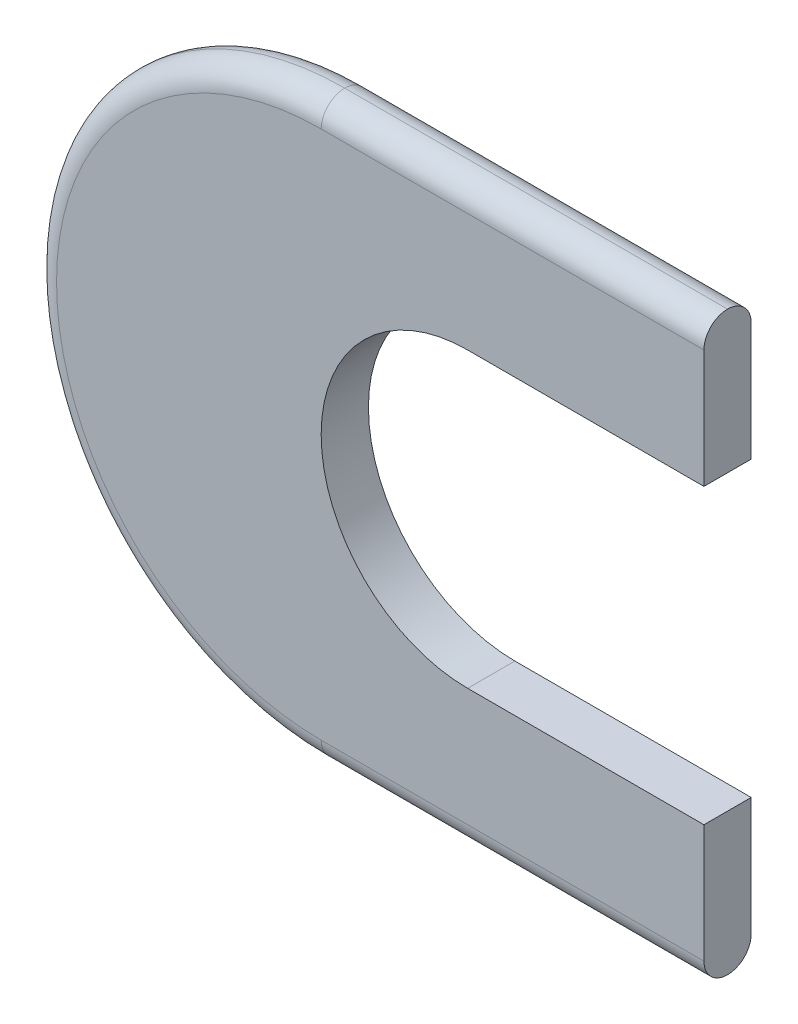
ISO-10303-21;
HEADER;
FILE_DESCRIPTION(('STEP AP214'),'2;1');
FILE_NAME('part.step','',(''),(''),'','','');
FILE_SCHEMA(('AUTOMOTIVE_DESIGN { 1 0 10303 214 1 1 1 1 }'));
ENDSEC;
DATA;
#1=APPLICATION_CONTEXT('core data for automotive mechanical design processes');
#2=APPLICATION_PROTOCOL_DEFINITION('international standard','automotive_design',2000,#1);
#3=PRODUCT_CONTEXT('',#1,'mechanical');
#4=PRODUCT('Part','Part','',(#3));
#5=PRODUCT_RELATED_PRODUCT_CATEGORY('part','',(#4));
#6=PRODUCT_DEFINITION_FORMATION('','',#4);
#7=PRODUCT_DEFINITION_CONTEXT('part definition',#1,'design');
#8=PRODUCT_DEFINITION('design','',#6,#7);
#9=PRODUCT_DEFINITION_SHAPE('','',#8);
#10=(LENGTH_UNIT() NAMED_UNIT(*) SI_UNIT(.MILLI.,.METRE.));
#11=(NAMED_UNIT(*) PLANE_ANGLE_UNIT() SI_UNIT($,.RADIAN.));
#12=(NAMED_UNIT(*) SI_UNIT($,.STERADIAN.) SOLID_ANGLE_UNIT());
#13=UNCERTAINTY_MEASURE_WITH_UNIT(LENGTH_MEASURE(1.E-05),#10,'distance_accuracy_value','');
#14=(GEOMETRIC_REPRESENTATION_CONTEXT(3) GLOBAL_UNCERTAINTY_ASSIGNED_CONTEXT((#13)) GLOBAL_UNIT_ASSIGNED_CONTEXT((#10,
#11,#12)) REPRESENTATION_CONTEXT('',''));
#15=CARTESIAN_POINT('',(0.,0.,0.));
#16=DIRECTION('',(0.,0.,1.));
#17=DIRECTION('',(1.,0.,0.));
#18=AXIS2_PLACEMENT_3D('',#15,#16,#17);
#19=CARTESIAN_POINT('',(0.,0.,1.));
#20=DIRECTION('',(0.,0.,-1.));
#21=DIRECTION('',(-1.,0.,0.));
#22=AXIS2_PLACEMENT_3D('',#19,#20,#21);
#23=CYLINDRICAL_SURFACE('',#22,3.1);
#24=CARTESIAN_POINT('',(0.,0.,0.));
#25=DIRECTION('',(0.,0.,-1.));
#26=DIRECTION('',(1.,0.,0.));
#27=AXIS2_PLACEMENT_3D('',#24,#25,#26);
#28=CIRCLE('',#27,3.1);
#29=CARTESIAN_POINT('',(0.,-3.1,0.));
#30=VERTEX_POINT('',#29);
#31=CARTESIAN_POINT('',(0.,3.1,0.));
#32=VERTEX_POINT('',#31);
#33=EDGE_CURVE('E180',#30,#32,#28,.T.);
#34=ORIENTED_EDGE('',*,*,#33,.T.);
#35=DIRECTION('',(0.,0.,-1.));
#36=VECTOR('',#35,1.);
#37=CARTESIAN_POINT('',(0.,3.1,1.));
#38=LINE('',#37,#36);
#39=CARTESIAN_POINT('',(0.,3.1,1.));
#40=VERTEX_POINT('',#39);
#41=EDGE_CURVE('E215',#40,#32,#38,.T.);
#42=ORIENTED_EDGE('',*,*,#41,.F.);
#43=CARTESIAN_POINT('',(0.,0.,1.));
#44=DIRECTION('',(0.,0.,-1.));
#45=DIRECTION('',(1.,0.,0.));
#46=AXIS2_PLACEMENT_3D('',#43,#44,#45);
#47=CIRCLE('',#46,3.1);
#48=CARTESIAN_POINT('',(0.,-3.1,1.));
#49=VERTEX_POINT('',#48);
#50=EDGE_CURVE('E203',#49,#40,#47,.T.);
#51=ORIENTED_EDGE('',*,*,#50,.F.);
#52=DIRECTION('',(0.,0.,-1.));
#53=VECTOR('',#52,1.);
#54=CARTESIAN_POINT('',(0.,-3.1,1.));
#55=LINE('',#54,#53);
#56=EDGE_CURVE('E204',#49,#30,#55,.T.);
#57=ORIENTED_EDGE('',*,*,#56,.T.);
#58=EDGE_LOOP('',(#34,#42,#51,#57));
#59=FACE_BOUND('',#58,.T.);
#60=ADVANCED_FACE('F39',(#59),#23,.F.);
#61=CARTESIAN_POINT('',(0.,3.1,1.));
#62=DIRECTION('',(0.,1.,0.));
#63=DIRECTION('',(0.,0.,1.));
#64=AXIS2_PLACEMENT_3D('',#61,#62,#63);
#65=PLANE('',#64);
#66=DIRECTION('',(1.,0.,0.));
#67=VECTOR('',#66,1.);
#68=CARTESIAN_POINT('',(0.,3.1,0.));
#69=LINE('',#68,#67);
#70=CARTESIAN_POINT('',(5.,3.1,0.));
#71=VERTEX_POINT('',#70);
#72=EDGE_CURVE('E83',#32,#71,#69,.T.);
#73=ORIENTED_EDGE('',*,*,#72,.T.);
#74=DIRECTION('',(0.,0.,-1.));
#75=VECTOR('',#74,1.);
#76=CARTESIAN_POINT('',(5.,3.1,1.));
#77=LINE('',#76,#75);
#78=CARTESIAN_POINT('',(5.,3.1,1.));
#79=VERTEX_POINT('',#78);
#80=EDGE_CURVE('E211',#79,#71,#77,.T.);
#81=ORIENTED_EDGE('',*,*,#80,.F.);
#82=DIRECTION('',(1.,0.,0.));
#83=VECTOR('',#82,1.);
#84=CARTESIAN_POINT('',(0.,3.1,1.));
#85=LINE('',#84,#83);
#86=EDGE_CURVE('E245',#40,#79,#85,.T.);
#87=ORIENTED_EDGE('',*,*,#86,.F.);
#88=ORIENTED_EDGE('',*,*,#41,.T.);
#89=EDGE_LOOP('',(#73,#81,#87,#88));
#90=FACE_BOUND('',#89,.T.);
#91=ADVANCED_FACE('F257',(#90),#65,.F.);
#92=CARTESIAN_POINT('',(5.,3.1,1.));
#93=DIRECTION('',(-1.,0.,0.));
#94=DIRECTION('',(0.,0.,1.));
#95=AXIS2_PLACEMENT_3D('',#92,#93,#94);
#96=PLANE('',#95);
#97=DIRECTION('',(0.,1.,0.));
#98=VECTOR('',#97,1.);
#99=CARTESIAN_POINT('',(5.,3.1,0.));
#100=LINE('',#99,#98);
#101=CARTESIAN_POINT('',(5.,5.6,0.));
#102=VERTEX_POINT('',#101);
#103=EDGE_CURVE('E188',#71,#102,#100,.T.);
#104=ORIENTED_EDGE('',*,*,#103,.T.);
#105=CARTESIAN_POINT('',(5.,5.6,0.5));
#106=DIRECTION('',(-1.,0.,0.));
#107=DIRECTION('',(0.,0.,1.));
#108=AXIS2_PLACEMENT_3D('',#105,#106,#107);
#109=CIRCLE('',#108,0.5);
#110=CARTESIAN_POINT('',(5.,6.1,0.5));
#111=VERTEX_POINT('',#110);
#112=EDGE_CURVE('E129',#102,#111,#109,.F.);
#113=ORIENTED_EDGE('',*,*,#112,.T.);
#114=CARTESIAN_POINT('',(5.,5.6,0.5));
#115=DIRECTION('',(-1.,0.,0.));
#116=DIRECTION('',(0.,0.,1.));
#117=AXIS2_PLACEMENT_3D('',#114,#115,#116);
#118=CIRCLE('',#117,0.5);
#119=CARTESIAN_POINT('',(5.,5.6,1.));
#120=VERTEX_POINT('',#119);
#121=EDGE_CURVE('E167',#111,#120,#118,.F.);
#122=ORIENTED_EDGE('',*,*,#121,.T.);
#123=DIRECTION('',(0.,1.,0.));
#124=VECTOR('',#123,1.);
#125=CARTESIAN_POINT('',(5.,3.1,1.));
#126=LINE('',#125,#124);
#127=EDGE_CURVE('E243',#79,#120,#126,.T.);
#128=ORIENTED_EDGE('',*,*,#127,.F.);
#129=ORIENTED_EDGE('',*,*,#80,.T.);
#130=EDGE_LOOP('',(#104,#113,#122,#128,#129));
#131=FACE_BOUND('',#130,.T.);
#132=ADVANCED_FACE('F227',(#131),#96,.F.);
#133=CARTESIAN_POINT('',(5.,-3.1,1.));
#134=DIRECTION('',(-1.,0.,0.));
#135=DIRECTION('',(0.,0.,1.));
#136=AXIS2_PLACEMENT_3D('',#133,#134,#135);
#137=PLANE('',#136);
#138=CARTESIAN_POINT('',(5.,-5.6,0.5));
#139=DIRECTION('',(-1.,0.,0.));
#140=DIRECTION('',(0.,0.,1.));
#141=AXIS2_PLACEMENT_3D('',#138,#139,#140);
#142=CIRCLE('',#141,0.5);
#143=CARTESIAN_POINT('',(5.,-5.6,1.));
#144=VERTEX_POINT('',#143);
#145=CARTESIAN_POINT('',(5.,-6.1,0.5));
#146=VERTEX_POINT('',#145);
#147=EDGE_CURVE('E120',#144,#146,#142,.F.);
#148=ORIENTED_EDGE('',*,*,#147,.T.);
#149=CARTESIAN_POINT('',(5.,-5.6,0.5));
#150=DIRECTION('',(-1.,0.,0.));
#151=DIRECTION('',(0.,0.,1.));
#152=AXIS2_PLACEMENT_3D('',#149,#150,#151);
#153=CIRCLE('',#152,0.5);
#154=CARTESIAN_POINT('',(5.,-5.6,0.));
#155=VERTEX_POINT('',#154);
#156=EDGE_CURVE('E123',#146,#155,#153,.F.);
#157=ORIENTED_EDGE('',*,*,#156,.T.);
#158=DIRECTION('',(0.,1.,0.));
#159=VECTOR('',#158,1.);
#160=CARTESIAN_POINT('',(5.,-3.1,0.));
#161=LINE('',#160,#159);
#162=CARTESIAN_POINT('',(5.,-3.1,0.));
#163=VERTEX_POINT('',#162);
#164=EDGE_CURVE('E197',#155,#163,#161,.T.);
#165=ORIENTED_EDGE('',*,*,#164,.T.);
#166=DIRECTION('',(0.,0.,-1.));
#167=VECTOR('',#166,1.);
#168=CARTESIAN_POINT('',(5.,-3.1,1.));
#169=LINE('',#168,#167);
#170=CARTESIAN_POINT('',(5.,-3.1,1.));
#171=VERTEX_POINT('',#170);
#172=EDGE_CURVE('E207',#171,#163,#169,.T.);
#173=ORIENTED_EDGE('',*,*,#172,.F.);
#174=DIRECTION('',(0.,1.,0.));
#175=VECTOR('',#174,1.);
#176=CARTESIAN_POINT('',(5.,-3.1,1.));
#177=LINE('',#176,#175);
#178=EDGE_CURVE('E127',#144,#171,#177,.T.);
#179=ORIENTED_EDGE('',*,*,#178,.F.);
#180=EDGE_LOOP('',(#148,#157,#165,#173,#179));
#181=FACE_BOUND('',#180,.T.);
#182=ADVANCED_FACE('F121',(#181),#137,.F.);
#183=CARTESIAN_POINT('',(0.,-3.1,1.));
#184=DIRECTION('',(0.,-1.,0.));
#185=DIRECTION('',(0.,0.,-1.));
#186=AXIS2_PLACEMENT_3D('',#183,#184,#185);
#187=PLANE('',#186);
#188=DIRECTION('',(-1.,0.,0.));
#189=VECTOR('',#188,1.);
#190=CARTESIAN_POINT('',(0.,-3.1,0.));
#191=LINE('',#190,#189);
#192=EDGE_CURVE('E200',#163,#30,#191,.T.);
#193=ORIENTED_EDGE('',*,*,#192,.T.);
#194=ORIENTED_EDGE('',*,*,#56,.F.);
#195=DIRECTION('',(-1.,0.,0.));
#196=VECTOR('',#195,1.);
#197=CARTESIAN_POINT('',(0.,-3.1,1.));
#198=LINE('',#197,#196);
#199=EDGE_CURVE('E191',#171,#49,#198,.T.);
#200=ORIENTED_EDGE('',*,*,#199,.F.);
#201=ORIENTED_EDGE('',*,*,#172,.T.);
#202=EDGE_LOOP('',(#193,#194,#200,#201));
#203=FACE_BOUND('',#202,.T.);
#204=ADVANCED_FACE('F235',(#203),#187,.F.);
#205=CARTESIAN_POINT('',(0.,0.,1.));
#206=DIRECTION('',(0.,0.,1.));
#207=DIRECTION('',(1.,0.,0.));
#208=AXIS2_PLACEMENT_3D('',#205,#206,#207);
#209=PLANE('',#208);
#210=ORIENTED_EDGE('',*,*,#127,.T.);
#211=DIRECTION('',(-1.,0.,0.));
#212=VECTOR('',#211,1.);
#213=CARTESIAN_POINT('',(-3.1,5.6,1.));
#214=LINE('',#213,#212);
#215=CARTESIAN_POINT('',(-3.1,5.6,1.));
#216=VERTEX_POINT('',#215);
#217=EDGE_CURVE('E11',#120,#216,#214,.T.);
#218=ORIENTED_EDGE('',*,*,#217,.T.);
#219=CARTESIAN_POINT('',(-3.1,0.,1.));
#220=DIRECTION('',(0.,0.,1.));
#221=DIRECTION('',(1.,0.,0.));
#222=AXIS2_PLACEMENT_3D('',#219,#220,#221);
#223=CIRCLE('',#222,5.6);
#224=CARTESIAN_POINT('',(-3.1,-5.6,1.));
#225=VERTEX_POINT('',#224);
#226=EDGE_CURVE('E58',#216,#225,#223,.T.);
#227=ORIENTED_EDGE('',*,*,#226,.T.);
#228=DIRECTION('',(1.,0.,0.));
#229=VECTOR('',#228,1.);
#230=CARTESIAN_POINT('',(5.,-5.6,1.));
#231=LINE('',#230,#229);
#232=EDGE_CURVE('E50',#225,#144,#231,.T.);
#233=ORIENTED_EDGE('',*,*,#232,.T.);
#234=ORIENTED_EDGE('',*,*,#178,.T.);
#235=ORIENTED_EDGE('',*,*,#199,.T.);
#236=ORIENTED_EDGE('',*,*,#50,.T.);
#237=ORIENTED_EDGE('',*,*,#86,.T.);
#238=EDGE_LOOP('',(#210,#218,#227,#233,#234,#235,#236,#237));
#239=FACE_BOUND('',#238,.T.);
#240=ADVANCED_FACE('F252',(#239),#209,.T.);
#241=CARTESIAN_POINT('',(0.,0.,0.));
#242=DIRECTION('',(0.,0.,1.));
#243=DIRECTION('',(1.,0.,0.));
#244=AXIS2_PLACEMENT_3D('',#241,#242,#243);
#245=PLANE('',#244);
#246=CARTESIAN_POINT('',(-3.1,0.,0.));
#247=DIRECTION('',(0.,0.,1.));
#248=DIRECTION('',(1.,0.,0.));
#249=AXIS2_PLACEMENT_3D('',#246,#247,#248);
#250=CIRCLE('',#249,5.6);
#251=CARTESIAN_POINT('',(-3.1,-5.6,0.));
#252=VERTEX_POINT('',#251);
#253=CARTESIAN_POINT('',(-3.1,5.6,0.));
#254=VERTEX_POINT('',#253);
#255=EDGE_CURVE('E177',#252,#254,#250,.F.);
#256=ORIENTED_EDGE('',*,*,#255,.T.);
#257=DIRECTION('',(-1.,0.,0.));
#258=VECTOR('',#257,1.);
#259=CARTESIAN_POINT('',(0.,5.6,0.));
#260=LINE('',#259,#258);
#261=EDGE_CURVE('E173',#254,#102,#260,.F.);
#262=ORIENTED_EDGE('',*,*,#261,.T.);
#263=ORIENTED_EDGE('',*,*,#103,.F.);
#264=ORIENTED_EDGE('',*,*,#72,.F.);
#265=ORIENTED_EDGE('',*,*,#33,.F.);
#266=ORIENTED_EDGE('',*,*,#192,.F.);
#267=ORIENTED_EDGE('',*,*,#164,.F.);
#268=DIRECTION('',(1.,0.,0.));
#269=VECTOR('',#268,1.);
#270=CARTESIAN_POINT('',(0.,-5.6,0.));
#271=LINE('',#270,#269);
#272=EDGE_CURVE('E137',#155,#252,#271,.F.);
#273=ORIENTED_EDGE('',*,*,#272,.T.);
#274=EDGE_LOOP('',(#256,#262,#263,#264,#265,#266,#267,#273));
#275=FACE_BOUND('',#274,.T.);
#276=ADVANCED_FACE('F230',(#275),#245,.F.);
#277=CARTESIAN_POINT('',(0.,-5.6,0.5));
#278=DIRECTION('',(-1.,0.,0.));
#279=DIRECTION('',(0.,0.,1.));
#280=AXIS2_PLACEMENT_3D('',#277,#278,#279);
#281=CYLINDRICAL_SURFACE('',#280,0.5);
#282=ORIENTED_EDGE('',*,*,#147,.F.);
#283=ORIENTED_EDGE('',*,*,#232,.F.);
#284=CARTESIAN_POINT('',(-3.1,-5.6,0.5));
#285=DIRECTION('',(-1.,0.,0.));
#286=DIRECTION('',(0.,0.,1.));
#287=AXIS2_PLACEMENT_3D('',#284,#285,#286);
#288=CIRCLE('',#287,0.5);
#289=CARTESIAN_POINT('',(-3.1,-6.1,0.5));
#290=VERTEX_POINT('',#289);
#291=EDGE_CURVE('E43',#290,#225,#288,.T.);
#292=ORIENTED_EDGE('',*,*,#291,.F.);
#293=DIRECTION('',(1.,0.,0.));
#294=VECTOR('',#293,1.);
#295=CARTESIAN_POINT('',(-3.1,-6.1,0.5));
#296=LINE('',#295,#294);
#297=EDGE_CURVE('E131',#146,#290,#296,.F.);
#298=ORIENTED_EDGE('',*,*,#297,.F.);
#299=EDGE_LOOP('',(#282,#283,#292,#298));
#300=FACE_BOUND('',#299,.T.);
#301=ADVANCED_FACE('F41',(#300),#281,.T.);
#302=CARTESIAN_POINT('',(-3.1,0.,0.5));
#303=DIRECTION('',(0.,0.,1.));
#304=DIRECTION('',(1.,0.,0.));
#305=AXIS2_PLACEMENT_3D('',#302,#303,#304);
#306=TOROIDAL_SURFACE('',#305,5.6,0.5);
#307=ORIENTED_EDGE('',*,*,#291,.T.);
#308=ORIENTED_EDGE('',*,*,#226,.F.);
#309=CARTESIAN_POINT('',(-3.1,5.6,0.5));
#310=DIRECTION('',(1.,0.,0.));
#311=DIRECTION('',(0.,0.,-1.));
#312=AXIS2_PLACEMENT_3D('',#309,#310,#311);
#313=CIRCLE('',#312,0.5);
#314=CARTESIAN_POINT('',(-3.1,6.1,0.5));
#315=VERTEX_POINT('',#314);
#316=EDGE_CURVE('E68',#315,#216,#313,.T.);
#317=ORIENTED_EDGE('',*,*,#316,.F.);
#318=CARTESIAN_POINT('',(-3.1,0.,0.5));
#319=DIRECTION('',(0.,0.,1.));
#320=DIRECTION('',(1.,0.,0.));
#321=AXIS2_PLACEMENT_3D('',#318,#319,#320);
#322=CIRCLE('',#321,6.1);
#323=EDGE_CURVE('E158',#290,#315,#322,.F.);
#324=ORIENTED_EDGE('',*,*,#323,.F.);
#325=EDGE_LOOP('',(#307,#308,#317,#324));
#326=FACE_BOUND('',#325,.T.);
#327=ADVANCED_FACE('F178',(#326),#306,.T.);
#328=CARTESIAN_POINT('',(5.,-5.6,0.5));
#329=DIRECTION('',(1.,0.,0.));
#330=DIRECTION('',(0.,0.,-1.));
#331=AXIS2_PLACEMENT_3D('',#328,#329,#330);
#332=CYLINDRICAL_SURFACE('',#331,0.5);
#333=ORIENTED_EDGE('',*,*,#156,.F.);
#334=ORIENTED_EDGE('',*,*,#297,.T.);
#335=CARTESIAN_POINT('',(-3.1,-5.6,0.5));
#336=DIRECTION('',(-1.,0.,0.));
#337=DIRECTION('',(0.,0.,1.));
#338=AXIS2_PLACEMENT_3D('',#335,#336,#337);
#339=CIRCLE('',#338,0.5);
#340=EDGE_CURVE('E154',#252,#290,#339,.T.);
#341=ORIENTED_EDGE('',*,*,#340,.F.);
#342=ORIENTED_EDGE('',*,*,#272,.F.);
#343=EDGE_LOOP('',(#333,#334,#341,#342));
#344=FACE_BOUND('',#343,.T.);
#345=ADVANCED_FACE('F136',(#344),#332,.T.);
#346=CARTESIAN_POINT('',(0.,5.6,0.5));
#347=DIRECTION('',(1.,0.,0.));
#348=DIRECTION('',(0.,0.,-1.));
#349=AXIS2_PLACEMENT_3D('',#346,#347,#348);
#350=CYLINDRICAL_SURFACE('',#349,0.5);
#351=ORIENTED_EDGE('',*,*,#217,.F.);
#352=ORIENTED_EDGE('',*,*,#121,.F.);
#353=DIRECTION('',(-1.,0.,0.));
#354=VECTOR('',#353,1.);
#355=CARTESIAN_POINT('',(5.,6.1,0.5));
#356=LINE('',#355,#354);
#357=EDGE_CURVE('E150',#315,#111,#356,.F.);
#358=ORIENTED_EDGE('',*,*,#357,.F.);
#359=ORIENTED_EDGE('',*,*,#316,.T.);
#360=EDGE_LOOP('',(#351,#352,#358,#359));
#361=FACE_BOUND('',#360,.T.);
#362=ADVANCED_FACE('F165',(#361),#350,.T.);
#363=CARTESIAN_POINT('',(-3.1,0.,0.5));
#364=DIRECTION('',(0.,0.,1.));
#365=DIRECTION('',(1.,0.,0.));
#366=AXIS2_PLACEMENT_3D('',#363,#364,#365);
#367=TOROIDAL_SURFACE('',#366,5.6,0.5);
#368=ORIENTED_EDGE('',*,*,#340,.T.);
#369=ORIENTED_EDGE('',*,*,#323,.T.);
#370=CARTESIAN_POINT('',(-3.1,5.6,0.5));
#371=DIRECTION('',(1.,0.,0.));
#372=DIRECTION('',(0.,0.,-1.));
#373=AXIS2_PLACEMENT_3D('',#370,#371,#372);
#374=CIRCLE('',#373,0.5);
#375=EDGE_CURVE('E146',#254,#315,#374,.T.);
#376=ORIENTED_EDGE('',*,*,#375,.F.);
#377=ORIENTED_EDGE('',*,*,#255,.F.);
#378=EDGE_LOOP('',(#368,#369,#376,#377));
#379=FACE_BOUND('',#378,.T.);
#380=ADVANCED_FACE('F176',(#379),#367,.T.);
#381=CARTESIAN_POINT('',(5.,5.6,0.5));
#382=DIRECTION('',(-1.,0.,0.));
#383=DIRECTION('',(0.,0.,1.));
#384=AXIS2_PLACEMENT_3D('',#381,#382,#383);
#385=CYLINDRICAL_SURFACE('',#384,0.5);
#386=ORIENTED_EDGE('',*,*,#112,.F.);
#387=ORIENTED_EDGE('',*,*,#261,.F.);
#388=ORIENTED_EDGE('',*,*,#375,.T.);
#389=ORIENTED_EDGE('',*,*,#357,.T.);
#390=EDGE_LOOP('',(#386,#387,#388,#389));
#391=FACE_BOUND('',#390,.T.);
#392=ADVANCED_FACE('F171',(#391),#385,.T.);
#393=CLOSED_SHELL('',(#60,#91,#132,#182,#204,#240,#276,#301,#327,#345,#362,#380,#392));
#394=MANIFOLD_SOLID_BREP('B2',#393);
#395=ADVANCED_BREP_SHAPE_REPRESENTATION('',(#18,#394),#14);
#396=SHAPE_DEFINITION_REPRESENTATION(#9,#395);
ENDSEC;
END-ISO-10303-21;
